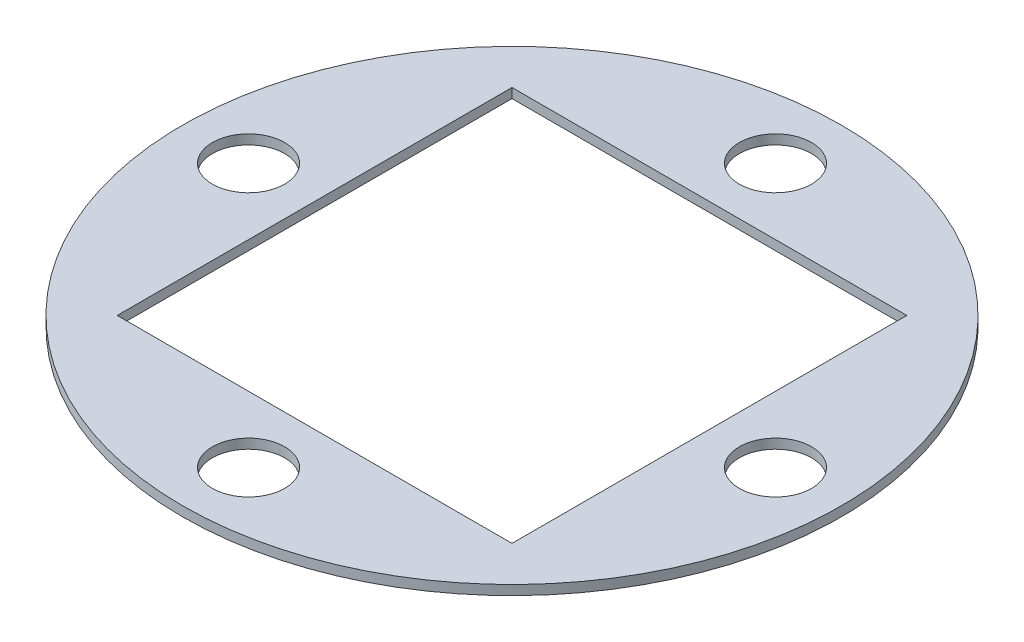
ISO-10303-21;
HEADER;
FILE_DESCRIPTION(('STEP AP214'),'2;1');
FILE_NAME('part.step','',(''),(''),'','','');
FILE_SCHEMA(('AUTOMOTIVE_DESIGN { 1 0 10303 214 1 1 1 1 }'));
ENDSEC;
DATA;
#1=APPLICATION_CONTEXT('core data for automotive mechanical design processes');
#2=APPLICATION_PROTOCOL_DEFINITION('international standard','automotive_design',2000,#1);
#3=PRODUCT_CONTEXT('',#1,'mechanical');
#4=PRODUCT('Part','Part','',(#3));
#5=PRODUCT_RELATED_PRODUCT_CATEGORY('part','',(#4));
#6=PRODUCT_DEFINITION_FORMATION('','',#4);
#7=PRODUCT_DEFINITION_CONTEXT('part definition',#1,'design');
#8=PRODUCT_DEFINITION('design','',#6,#7);
#9=PRODUCT_DEFINITION_SHAPE('','',#8);
#10=(LENGTH_UNIT() NAMED_UNIT(*) SI_UNIT(.MILLI.,.METRE.));
#11=(NAMED_UNIT(*) PLANE_ANGLE_UNIT() SI_UNIT($,.RADIAN.));
#12=(NAMED_UNIT(*) SI_UNIT($,.STERADIAN.) SOLID_ANGLE_UNIT());
#13=UNCERTAINTY_MEASURE_WITH_UNIT(LENGTH_MEASURE(1.E-05),#10,'distance_accuracy_value','');
#14=(GEOMETRIC_REPRESENTATION_CONTEXT(3) GLOBAL_UNCERTAINTY_ASSIGNED_CONTEXT((#13)) GLOBAL_UNIT_ASSIGNED_CONTEXT((#10,
#11,#12)) REPRESENTATION_CONTEXT('',''));
#15=CARTESIAN_POINT('',(0.,0.,0.));
#16=DIRECTION('',(0.,0.,1.));
#17=DIRECTION('',(1.,0.,0.));
#18=AXIS2_PLACEMENT_3D('',#15,#16,#17);
#19=CARTESIAN_POINT('',(0.,2.54,0.));
#20=DIRECTION('',(0.,-1.,0.));
#21=DIRECTION('',(0.,0.,-1.));
#22=AXIS2_PLACEMENT_3D('',#19,#20,#21);
#23=CYLINDRICAL_SURFACE('',#22,86.9315);
#24=CARTESIAN_POINT('',(0.,2.54,0.));
#25=DIRECTION('',(0.,1.,0.));
#26=DIRECTION('',(0.,0.,1.));
#27=AXIS2_PLACEMENT_3D('',#24,#25,#26);
#28=CIRCLE('',#27,86.9315);
#29=CARTESIAN_POINT('',(0.,2.54,86.9315));
#30=VERTEX_POINT('',#29);
#31=EDGE_CURVE('E11',#30,#30,#28,.T.);
#32=ORIENTED_EDGE('',*,*,#31,.F.);
#33=EDGE_LOOP('',(#32));
#34=FACE_BOUND('',#33,.T.);
#35=CARTESIAN_POINT('',(0.,0.,0.));
#36=DIRECTION('',(0.,1.,0.));
#37=DIRECTION('',(0.,0.,1.));
#38=AXIS2_PLACEMENT_3D('',#35,#36,#37);
#39=CIRCLE('',#38,86.9315);
#40=CARTESIAN_POINT('',(0.,0.,86.9315));
#41=VERTEX_POINT('',#40);
#42=EDGE_CURVE('E47',#41,#41,#39,.T.);
#43=ORIENTED_EDGE('',*,*,#42,.T.);
#44=EDGE_LOOP('',(#43));
#45=FACE_BOUND('',#44,.T.);
#46=ADVANCED_FACE('F39',(#34,#45),#23,.T.);
#47=CARTESIAN_POINT('',(0.,2.54,0.));
#48=DIRECTION('',(0.,1.,0.));
#49=DIRECTION('',(0.,0.,1.));
#50=AXIS2_PLACEMENT_3D('',#47,#48,#49);
#51=PLANE('',#50);
#52=CARTESIAN_POINT('',(0.,2.54,-69.50075));
#53=DIRECTION('',(0.,1.,0.));
#54=DIRECTION('',(0.,0.,1.));
#55=AXIS2_PLACEMENT_3D('',#52,#53,#54);
#56=CIRCLE('',#55,9.525);
#57=CARTESIAN_POINT('',(0.,2.54,-59.97575));
#58=VERTEX_POINT('',#57);
#59=EDGE_CURVE('E126',#58,#58,#56,.T.);
#60=ORIENTED_EDGE('',*,*,#59,.F.);
#61=EDGE_LOOP('',(#60));
#62=FACE_BOUND('',#61,.T.);
#63=CARTESIAN_POINT('',(69.50075,2.54,0.));
#64=DIRECTION('',(0.,1.,0.));
#65=DIRECTION('',(0.,0.,1.));
#66=AXIS2_PLACEMENT_3D('',#63,#64,#65);
#67=CIRCLE('',#66,9.52499999999999);
#68=CARTESIAN_POINT('',(69.50075,2.54,9.52499999999999));
#69=VERTEX_POINT('',#68);
#70=EDGE_CURVE('E105',#69,#69,#67,.T.);
#71=ORIENTED_EDGE('',*,*,#70,.F.);
#72=EDGE_LOOP('',(#71));
#73=FACE_BOUND('',#72,.T.);
#74=CARTESIAN_POINT('',(0.,2.54,69.50075));
#75=DIRECTION('',(0.,1.,0.));
#76=DIRECTION('',(0.,0.,1.));
#77=AXIS2_PLACEMENT_3D('',#74,#75,#76);
#78=CIRCLE('',#77,9.525);
#79=CARTESIAN_POINT('',(0.,2.54,79.02575));
#80=VERTEX_POINT('',#79);
#81=EDGE_CURVE('E246',#80,#80,#78,.T.);
#82=ORIENTED_EDGE('',*,*,#81,.F.);
#83=EDGE_LOOP('',(#82));
#84=FACE_BOUND('',#83,.T.);
#85=CARTESIAN_POINT('',(-69.50075,2.54,0.));
#86=DIRECTION('',(0.,1.,0.));
#87=DIRECTION('',(0.,0.,1.));
#88=AXIS2_PLACEMENT_3D('',#85,#86,#87);
#89=CIRCLE('',#88,9.525);
#90=CARTESIAN_POINT('',(-69.50075,2.54,9.525));
#91=VERTEX_POINT('',#90);
#92=EDGE_CURVE('E253',#91,#91,#89,.T.);
#93=ORIENTED_EDGE('',*,*,#92,.F.);
#94=EDGE_LOOP('',(#93));
#95=FACE_BOUND('',#94,.T.);
#96=DIRECTION('',(0.,0.,-1.));
#97=VECTOR('',#96,1.);
#98=CARTESIAN_POINT('',(52.07,2.54,-52.07));
#99=LINE('',#98,#97);
#100=CARTESIAN_POINT('',(52.07,2.54,52.07));
#101=VERTEX_POINT('',#100);
#102=CARTESIAN_POINT('',(52.07,2.54,-52.07));
#103=VERTEX_POINT('',#102);
#104=EDGE_CURVE('E55',#101,#103,#99,.T.);
#105=ORIENTED_EDGE('',*,*,#104,.F.);
#106=DIRECTION('',(1.,0.,0.));
#107=VECTOR('',#106,1.);
#108=CARTESIAN_POINT('',(-52.07,2.54,52.07));
#109=LINE('',#108,#107);
#110=CARTESIAN_POINT('',(-52.07,2.54,52.07));
#111=VERTEX_POINT('',#110);
#112=EDGE_CURVE('E99',#111,#101,#109,.T.);
#113=ORIENTED_EDGE('',*,*,#112,.F.);
#114=DIRECTION('',(0.,0.,1.));
#115=VECTOR('',#114,1.);
#116=CARTESIAN_POINT('',(-52.07,2.54,-52.07));
#117=LINE('',#116,#115);
#118=CARTESIAN_POINT('',(-52.07,2.54,-52.07));
#119=VERTEX_POINT('',#118);
#120=EDGE_CURVE('E102',#119,#111,#117,.T.);
#121=ORIENTED_EDGE('',*,*,#120,.F.);
#122=DIRECTION('',(-1.,0.,0.));
#123=VECTOR('',#122,1.);
#124=CARTESIAN_POINT('',(-52.07,2.54,-52.07));
#125=LINE('',#124,#123);
#126=EDGE_CURVE('E111',#103,#119,#125,.T.);
#127=ORIENTED_EDGE('',*,*,#126,.F.);
#128=EDGE_LOOP('',(#105,#113,#121,#127));
#129=FACE_BOUND('',#128,.T.);
#130=ORIENTED_EDGE('',*,*,#31,.T.);
#131=EDGE_LOOP('',(#130));
#132=FACE_BOUND('',#131,.T.);
#133=ADVANCED_FACE('F150',(#62,#73,#84,#95,#129,#132),#51,.T.);
#134=CARTESIAN_POINT('',(0.,0.,0.));
#135=DIRECTION('',(0.,1.,0.));
#136=DIRECTION('',(0.,0.,1.));
#137=AXIS2_PLACEMENT_3D('',#134,#135,#136);
#138=PLANE('',#137);
#139=CARTESIAN_POINT('',(0.,0.,-69.50075));
#140=DIRECTION('',(0.,1.,0.));
#141=DIRECTION('',(0.,0.,1.));
#142=AXIS2_PLACEMENT_3D('',#139,#140,#141);
#143=CIRCLE('',#142,9.525);
#144=CARTESIAN_POINT('',(0.,0.,-59.97575));
#145=VERTEX_POINT('',#144);
#146=EDGE_CURVE('E42',#145,#145,#143,.T.);
#147=ORIENTED_EDGE('',*,*,#146,.T.);
#148=EDGE_LOOP('',(#147));
#149=FACE_BOUND('',#148,.T.);
#150=CARTESIAN_POINT('',(69.50075,0.,0.));
#151=DIRECTION('',(0.,1.,0.));
#152=DIRECTION('',(0.,0.,1.));
#153=AXIS2_PLACEMENT_3D('',#150,#151,#152);
#154=CIRCLE('',#153,9.52499999999999);
#155=CARTESIAN_POINT('',(69.50075,0.,9.52499999999999));
#156=VERTEX_POINT('',#155);
#157=EDGE_CURVE('E128',#156,#156,#154,.T.);
#158=ORIENTED_EDGE('',*,*,#157,.T.);
#159=EDGE_LOOP('',(#158));
#160=FACE_BOUND('',#159,.T.);
#161=CARTESIAN_POINT('',(0.,0.,69.50075));
#162=DIRECTION('',(0.,1.,0.));
#163=DIRECTION('',(0.,0.,1.));
#164=AXIS2_PLACEMENT_3D('',#161,#162,#163);
#165=CIRCLE('',#164,9.525);
#166=CARTESIAN_POINT('',(0.,0.,79.02575));
#167=VERTEX_POINT('',#166);
#168=EDGE_CURVE('E125',#167,#167,#165,.T.);
#169=ORIENTED_EDGE('',*,*,#168,.T.);
#170=EDGE_LOOP('',(#169));
#171=FACE_BOUND('',#170,.T.);
#172=CARTESIAN_POINT('',(-69.50075,0.,0.));
#173=DIRECTION('',(0.,1.,0.));
#174=DIRECTION('',(0.,0.,1.));
#175=AXIS2_PLACEMENT_3D('',#172,#173,#174);
#176=CIRCLE('',#175,9.525);
#177=CARTESIAN_POINT('',(-69.50075,0.,9.525));
#178=VERTEX_POINT('',#177);
#179=EDGE_CURVE('E122',#178,#178,#176,.T.);
#180=ORIENTED_EDGE('',*,*,#179,.T.);
#181=EDGE_LOOP('',(#180));
#182=FACE_BOUND('',#181,.T.);
#183=DIRECTION('',(1.,0.,0.));
#184=VECTOR('',#183,1.);
#185=CARTESIAN_POINT('',(-52.07,0.,52.07));
#186=LINE('',#185,#184);
#187=CARTESIAN_POINT('',(-52.07,0.,52.07));
#188=VERTEX_POINT('',#187);
#189=CARTESIAN_POINT('',(52.07,0.,52.07));
#190=VERTEX_POINT('',#189);
#191=EDGE_CURVE('E89',#188,#190,#186,.T.);
#192=ORIENTED_EDGE('',*,*,#191,.T.);
#193=DIRECTION('',(0.,0.,-1.));
#194=VECTOR('',#193,1.);
#195=CARTESIAN_POINT('',(52.07,0.,-52.07));
#196=LINE('',#195,#194);
#197=CARTESIAN_POINT('',(52.07,0.,-52.07));
#198=VERTEX_POINT('',#197);
#199=EDGE_CURVE('E83',#190,#198,#196,.T.);
#200=ORIENTED_EDGE('',*,*,#199,.T.);
#201=DIRECTION('',(-1.,0.,0.));
#202=VECTOR('',#201,1.);
#203=CARTESIAN_POINT('',(-52.07,0.,-52.07));
#204=LINE('',#203,#202);
#205=CARTESIAN_POINT('',(-52.07,0.,-52.07));
#206=VERTEX_POINT('',#205);
#207=EDGE_CURVE('E92',#198,#206,#204,.T.);
#208=ORIENTED_EDGE('',*,*,#207,.T.);
#209=DIRECTION('',(0.,0.,1.));
#210=VECTOR('',#209,1.);
#211=CARTESIAN_POINT('',(-52.07,0.,-52.07));
#212=LINE('',#211,#210);
#213=EDGE_CURVE('E63',#206,#188,#212,.T.);
#214=ORIENTED_EDGE('',*,*,#213,.T.);
#215=EDGE_LOOP('',(#192,#200,#208,#214));
#216=FACE_BOUND('',#215,.T.);
#217=ORIENTED_EDGE('',*,*,#42,.F.);
#218=EDGE_LOOP('',(#217));
#219=FACE_BOUND('',#218,.T.);
#220=ADVANCED_FACE('F96',(#149,#160,#171,#182,#216,#219),#138,.F.);
#221=CARTESIAN_POINT('',(52.07,0.,-52.07));
#222=DIRECTION('',(1.,0.,0.));
#223=DIRECTION('',(0.,0.,-1.));
#224=AXIS2_PLACEMENT_3D('',#221,#222,#223);
#225=PLANE('',#224);
#226=ORIENTED_EDGE('',*,*,#104,.T.);
#227=DIRECTION('',(0.,1.,0.));
#228=VECTOR('',#227,1.);
#229=CARTESIAN_POINT('',(52.07,0.,-52.07));
#230=LINE('',#229,#228);
#231=EDGE_CURVE('E79',#198,#103,#230,.T.);
#232=ORIENTED_EDGE('',*,*,#231,.F.);
#233=ORIENTED_EDGE('',*,*,#199,.F.);
#234=DIRECTION('',(0.,1.,0.));
#235=VECTOR('',#234,1.);
#236=CARTESIAN_POINT('',(52.07,0.,52.07));
#237=LINE('',#236,#235);
#238=EDGE_CURVE('E115',#190,#101,#237,.T.);
#239=ORIENTED_EDGE('',*,*,#238,.T.);
#240=EDGE_LOOP('',(#226,#232,#233,#239));
#241=FACE_BOUND('',#240,.T.);
#242=ADVANCED_FACE('F81',(#241),#225,.F.);
#243=CARTESIAN_POINT('',(-52.07,0.,52.07));
#244=DIRECTION('',(0.,0.,1.));
#245=DIRECTION('',(1.,0.,0.));
#246=AXIS2_PLACEMENT_3D('',#243,#244,#245);
#247=PLANE('',#246);
#248=ORIENTED_EDGE('',*,*,#112,.T.);
#249=ORIENTED_EDGE('',*,*,#238,.F.);
#250=ORIENTED_EDGE('',*,*,#191,.F.);
#251=DIRECTION('',(0.,1.,0.));
#252=VECTOR('',#251,1.);
#253=CARTESIAN_POINT('',(-52.07,0.,52.07));
#254=LINE('',#253,#252);
#255=EDGE_CURVE('E117',#188,#111,#254,.T.);
#256=ORIENTED_EDGE('',*,*,#255,.T.);
#257=EDGE_LOOP('',(#248,#249,#250,#256));
#258=FACE_BOUND('',#257,.T.);
#259=ADVANCED_FACE('F165',(#258),#247,.F.);
#260=CARTESIAN_POINT('',(-52.07,0.,-52.07));
#261=DIRECTION('',(-1.,0.,0.));
#262=DIRECTION('',(0.,0.,1.));
#263=AXIS2_PLACEMENT_3D('',#260,#261,#262);
#264=PLANE('',#263);
#265=ORIENTED_EDGE('',*,*,#120,.T.);
#266=ORIENTED_EDGE('',*,*,#255,.F.);
#267=ORIENTED_EDGE('',*,*,#213,.F.);
#268=DIRECTION('',(0.,1.,0.));
#269=VECTOR('',#268,1.);
#270=CARTESIAN_POINT('',(-52.07,0.,-52.07));
#271=LINE('',#270,#269);
#272=EDGE_CURVE('E88',#206,#119,#271,.T.);
#273=ORIENTED_EDGE('',*,*,#272,.T.);
#274=EDGE_LOOP('',(#265,#266,#267,#273));
#275=FACE_BOUND('',#274,.T.);
#276=ADVANCED_FACE('F171',(#275),#264,.F.);
#277=CARTESIAN_POINT('',(-52.07,0.,-52.07));
#278=DIRECTION('',(0.,0.,-1.));
#279=DIRECTION('',(-1.,0.,0.));
#280=AXIS2_PLACEMENT_3D('',#277,#278,#279);
#281=PLANE('',#280);
#282=ORIENTED_EDGE('',*,*,#126,.T.);
#283=ORIENTED_EDGE('',*,*,#272,.F.);
#284=ORIENTED_EDGE('',*,*,#207,.F.);
#285=ORIENTED_EDGE('',*,*,#231,.T.);
#286=EDGE_LOOP('',(#282,#283,#284,#285));
#287=FACE_BOUND('',#286,.T.);
#288=ADVANCED_FACE('F93',(#287),#281,.F.);
#289=CARTESIAN_POINT('',(-69.50075,-200.66,0.));
#290=DIRECTION('',(0.,1.,0.));
#291=DIRECTION('',(0.,0.,1.));
#292=AXIS2_PLACEMENT_3D('',#289,#290,#291);
#293=CYLINDRICAL_SURFACE('',#292,9.525);
#294=ORIENTED_EDGE('',*,*,#92,.T.);
#295=EDGE_LOOP('',(#294));
#296=FACE_BOUND('',#295,.T.);
#297=ORIENTED_EDGE('',*,*,#179,.F.);
#298=EDGE_LOOP('',(#297));
#299=FACE_BOUND('',#298,.T.);
#300=ADVANCED_FACE('F170',(#296,#299),#293,.F.);
#301=CARTESIAN_POINT('',(0.,-200.66,69.50075));
#302=DIRECTION('',(0.,1.,0.));
#303=DIRECTION('',(0.,0.,1.));
#304=AXIS2_PLACEMENT_3D('',#301,#302,#303);
#305=CYLINDRICAL_SURFACE('',#304,9.525);
#306=ORIENTED_EDGE('',*,*,#81,.T.);
#307=EDGE_LOOP('',(#306));
#308=FACE_BOUND('',#307,.T.);
#309=ORIENTED_EDGE('',*,*,#168,.F.);
#310=EDGE_LOOP('',(#309));
#311=FACE_BOUND('',#310,.T.);
#312=ADVANCED_FACE('F144',(#308,#311),#305,.F.);
#313=CARTESIAN_POINT('',(69.50075,-200.66,0.));
#314=DIRECTION('',(0.,1.,0.));
#315=DIRECTION('',(0.,0.,1.));
#316=AXIS2_PLACEMENT_3D('',#313,#314,#315);
#317=CYLINDRICAL_SURFACE('',#316,9.52499999999999);
#318=ORIENTED_EDGE('',*,*,#70,.T.);
#319=EDGE_LOOP('',(#318));
#320=FACE_BOUND('',#319,.T.);
#321=ORIENTED_EDGE('',*,*,#157,.F.);
#322=EDGE_LOOP('',(#321));
#323=FACE_BOUND('',#322,.T.);
#324=ADVANCED_FACE('F138',(#320,#323),#317,.F.);
#325=CARTESIAN_POINT('',(0.,-200.66,-69.50075));
#326=DIRECTION('',(0.,1.,0.));
#327=DIRECTION('',(0.,0.,1.));
#328=AXIS2_PLACEMENT_3D('',#325,#326,#327);
#329=CYLINDRICAL_SURFACE('',#328,9.525);
#330=ORIENTED_EDGE('',*,*,#59,.T.);
#331=EDGE_LOOP('',(#330));
#332=FACE_BOUND('',#331,.T.);
#333=ORIENTED_EDGE('',*,*,#146,.F.);
#334=EDGE_LOOP('',(#333));
#335=FACE_BOUND('',#334,.T.);
#336=ADVANCED_FACE('F136',(#332,#335),#329,.F.);
#337=CLOSED_SHELL('',(#46,#133,#220,#242,#259,#276,#288,#300,#312,#324,#336));
#338=MANIFOLD_SOLID_BREP('B2',#337);
#339=ADVANCED_BREP_SHAPE_REPRESENTATION('',(#18,#338),#14);
#340=SHAPE_DEFINITION_REPRESENTATION(#9,#339);
ENDSEC;
END-ISO-10303-21;
